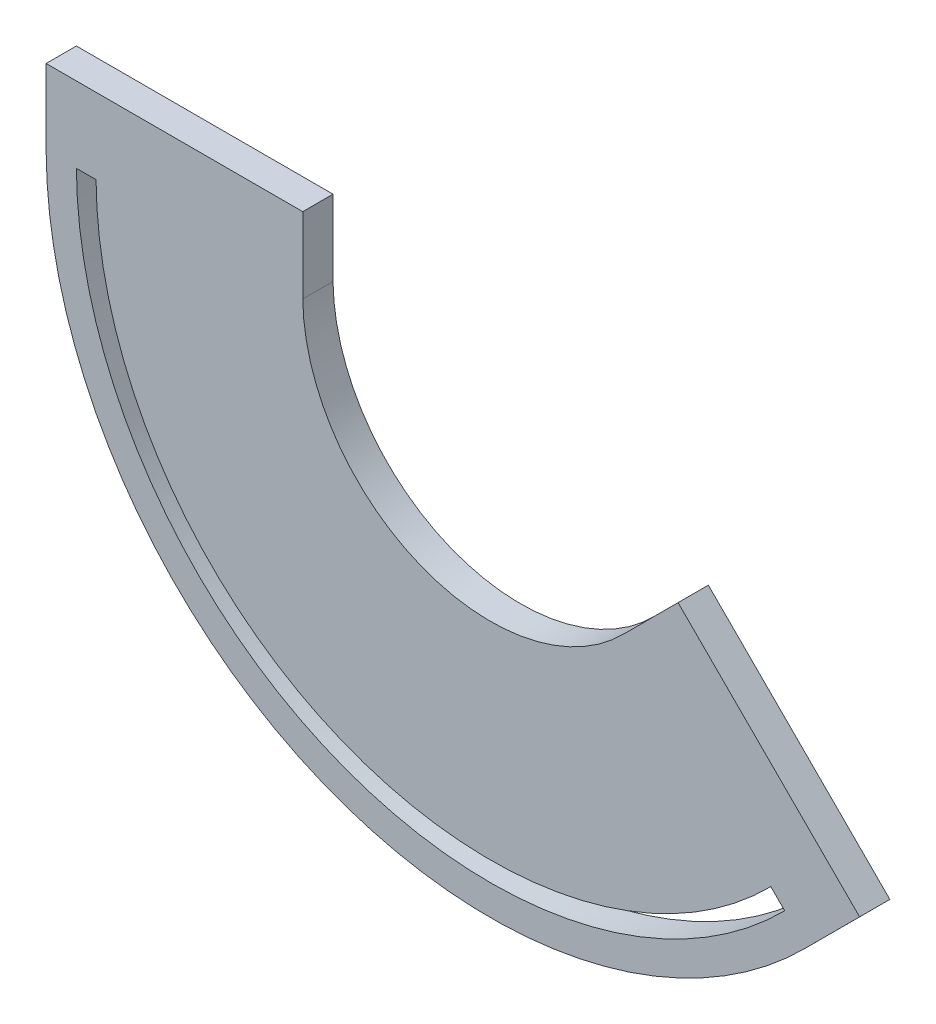
ISO-10303-21;
HEADER;
FILE_DESCRIPTION(('STEP AP214'),'2;1');
FILE_NAME('part.step','',(''),(''),'','','');
FILE_SCHEMA(('AUTOMOTIVE_DESIGN { 1 0 10303 214 1 1 1 1 }'));
ENDSEC;
DATA;
#1=APPLICATION_CONTEXT('core data for automotive mechanical design processes');
#2=APPLICATION_PROTOCOL_DEFINITION('international standard','automotive_design',2000,#1);
#3=PRODUCT_CONTEXT('',#1,'mechanical');
#4=PRODUCT('Part','Part','',(#3));
#5=PRODUCT_RELATED_PRODUCT_CATEGORY('part','',(#4));
#6=PRODUCT_DEFINITION_FORMATION('','',#4);
#7=PRODUCT_DEFINITION_CONTEXT('part definition',#1,'design');
#8=PRODUCT_DEFINITION('design','',#6,#7);
#9=PRODUCT_DEFINITION_SHAPE('','',#8);
#10=(LENGTH_UNIT() NAMED_UNIT(*) SI_UNIT(.MILLI.,.METRE.));
#11=(NAMED_UNIT(*) PLANE_ANGLE_UNIT() SI_UNIT($,.RADIAN.));
#12=(NAMED_UNIT(*) SI_UNIT($,.STERADIAN.) SOLID_ANGLE_UNIT());
#13=UNCERTAINTY_MEASURE_WITH_UNIT(LENGTH_MEASURE(1.E-05),#10,'distance_accuracy_value','');
#14=(GEOMETRIC_REPRESENTATION_CONTEXT(3) GLOBAL_UNCERTAINTY_ASSIGNED_CONTEXT((#13)) GLOBAL_UNIT_ASSIGNED_CONTEXT((#10,
#11,#12)) REPRESENTATION_CONTEXT('',''));
#15=CARTESIAN_POINT('',(0.,0.,0.));
#16=DIRECTION('',(0.,0.,1.));
#17=DIRECTION('',(1.,0.,0.));
#18=AXIS2_PLACEMENT_3D('',#15,#16,#17);
#19=CARTESIAN_POINT('',(0.,0.,5.08));
#20=DIRECTION('',(0.,0.,-1.));
#21=DIRECTION('',(-1.,0.,0.));
#22=AXIS2_PLACEMENT_3D('',#19,#20,#21);
#23=CYLINDRICAL_SURFACE('',#22,31.496);
#24=CARTESIAN_POINT('',(0.,0.,0.));
#25=DIRECTION('',(0.,0.,-1.));
#26=DIRECTION('',(1.,0.,0.));
#27=AXIS2_PLACEMENT_3D('',#24,#25,#26);
#28=CIRCLE('',#27,31.496);
#29=CARTESIAN_POINT('',(22.5377251884212,-22.001112683935,0.));
#30=VERTEX_POINT('',#29);
#31=CARTESIAN_POINT('',(-31.4937142857113,-0.379442340791523,0.));
#32=VERTEX_POINT('',#31);
#33=EDGE_CURVE('E156',#30,#32,#28,.T.);
#34=ORIENTED_EDGE('',*,*,#33,.T.);
#35=DIRECTION('',(0.,0.,-1.));
#36=VECTOR('',#35,1.);
#37=CARTESIAN_POINT('',(-31.4937142857113,-0.379442340791523,5.08));
#38=LINE('',#37,#36);
#39=CARTESIAN_POINT('',(-31.4937142857113,-0.379442340791523,5.08));
#40=VERTEX_POINT('',#39);
#41=EDGE_CURVE('E11',#40,#32,#38,.T.);
#42=ORIENTED_EDGE('',*,*,#41,.F.);
#43=CARTESIAN_POINT('',(0.,0.,5.08));
#44=DIRECTION('',(0.,0.,-1.));
#45=DIRECTION('',(1.,0.,0.));
#46=AXIS2_PLACEMENT_3D('',#43,#44,#45);
#47=CIRCLE('',#46,31.496);
#48=CARTESIAN_POINT('',(22.5377251884212,-22.001112683935,5.08));
#49=VERTEX_POINT('',#48);
#50=EDGE_CURVE('E160',#49,#40,#47,.T.);
#51=ORIENTED_EDGE('',*,*,#50,.F.);
#52=DIRECTION('',(0.,0.,-1.));
#53=VECTOR('',#52,1.);
#54=CARTESIAN_POINT('',(22.5377251884212,-22.001112683935,5.08));
#55=LINE('',#54,#53);
#56=EDGE_CURVE('E178',#49,#30,#55,.T.);
#57=ORIENTED_EDGE('',*,*,#56,.T.);
#58=EDGE_LOOP('',(#34,#42,#51,#57));
#59=FACE_BOUND('',#58,.T.);
#60=ADVANCED_FACE('F35',(#59),#23,.F.);
#61=CARTESIAN_POINT('',(-31.4937142857113,-0.379442340791523,5.08));
#62=DIRECTION('',(-1.,0.,0.));
#63=DIRECTION('',(0.,0.,1.));
#64=AXIS2_PLACEMENT_3D('',#61,#62,#63);
#65=PLANE('',#64);
#66=DIRECTION('',(0.,1.,0.));
#67=VECTOR('',#66,1.);
#68=CARTESIAN_POINT('',(-31.4937142857113,-0.379442340791523,0.));
#69=LINE('',#68,#67);
#70=CARTESIAN_POINT('',(-31.4937142857113,12.3205576592085,0.));
#71=VERTEX_POINT('',#70);
#72=EDGE_CURVE('E181',#32,#71,#69,.T.);
#73=ORIENTED_EDGE('',*,*,#72,.T.);
#74=DIRECTION('',(0.,0.,-1.));
#75=VECTOR('',#74,1.);
#76=CARTESIAN_POINT('',(-31.4937142857113,12.3205576592085,5.08));
#77=LINE('',#76,#75);
#78=CARTESIAN_POINT('',(-31.4937142857113,12.3205576592085,5.08));
#79=VERTEX_POINT('',#78);
#80=EDGE_CURVE('E42',#79,#71,#77,.T.);
#81=ORIENTED_EDGE('',*,*,#80,.F.);
#82=DIRECTION('',(0.,1.,0.));
#83=VECTOR('',#82,1.);
#84=CARTESIAN_POINT('',(-31.4937142857113,-0.379442340791523,5.08));
#85=LINE('',#84,#83);
#86=EDGE_CURVE('E163',#40,#79,#85,.T.);
#87=ORIENTED_EDGE('',*,*,#86,.F.);
#88=ORIENTED_EDGE('',*,*,#41,.T.);
#89=EDGE_LOOP('',(#73,#81,#87,#88));
#90=FACE_BOUND('',#89,.T.);
#91=ADVANCED_FACE('F236',(#90),#65,.F.);
#92=CARTESIAN_POINT('',(-74.5750346393202,12.3205576592085,5.08));
#93=DIRECTION('',(0.,-1.,0.));
#94=DIRECTION('',(0.,0.,-1.));
#95=AXIS2_PLACEMENT_3D('',#92,#93,#94);
#96=PLANE('',#95);
#97=DIRECTION('',(-1.,0.,0.));
#98=VECTOR('',#97,1.);
#99=CARTESIAN_POINT('',(-74.5750346393202,12.3205576592085,0.));
#100=LINE('',#99,#98);
#101=CARTESIAN_POINT('',(-74.5750346393202,12.3205576592085,0.));
#102=VERTEX_POINT('',#101);
#103=EDGE_CURVE('E183',#71,#102,#100,.T.);
#104=ORIENTED_EDGE('',*,*,#103,.T.);
#105=DIRECTION('',(0.,0.,-1.));
#106=VECTOR('',#105,1.);
#107=CARTESIAN_POINT('',(-74.5750346393202,12.3205576592085,5.08));
#108=LINE('',#107,#106);
#109=CARTESIAN_POINT('',(-74.5750346393202,12.3205576592085,5.08));
#110=VERTEX_POINT('',#109);
#111=EDGE_CURVE('E208',#110,#102,#108,.T.);
#112=ORIENTED_EDGE('',*,*,#111,.F.);
#113=DIRECTION('',(-1.,0.,0.));
#114=VECTOR('',#113,1.);
#115=CARTESIAN_POINT('',(-74.5750346393202,12.3205576592085,5.08));
#116=LINE('',#115,#114);
#117=EDGE_CURVE('E166',#79,#110,#116,.T.);
#118=ORIENTED_EDGE('',*,*,#117,.F.);
#119=ORIENTED_EDGE('',*,*,#80,.T.);
#120=EDGE_LOOP('',(#104,#112,#118,#119));
#121=FACE_BOUND('',#120,.T.);
#122=ADVANCED_FACE('F215',(#121),#96,.F.);
#123=CARTESIAN_POINT('',(-74.5750346393202,-0.379442340791523,5.08));
#124=DIRECTION('',(1.,0.,0.));
#125=DIRECTION('',(0.,0.,-1.));
#126=AXIS2_PLACEMENT_3D('',#123,#124,#125);
#127=PLANE('',#126);
#128=DIRECTION('',(0.,-1.,0.));
#129=VECTOR('',#128,1.);
#130=CARTESIAN_POINT('',(-74.5750346393202,-0.379442340791523,0.));
#131=LINE('',#130,#129);
#132=CARTESIAN_POINT('',(-74.5750346393202,-0.379442340791523,0.));
#133=VERTEX_POINT('',#132);
#134=EDGE_CURVE('E185',#102,#133,#131,.T.);
#135=ORIENTED_EDGE('',*,*,#134,.T.);
#136=DIRECTION('',(0.,0.,-1.));
#137=VECTOR('',#136,1.);
#138=CARTESIAN_POINT('',(-74.5750346393202,-0.379442340791523,5.08));
#139=LINE('',#138,#137);
#140=CARTESIAN_POINT('',(-74.5750346393202,-0.379442340791523,5.08));
#141=VERTEX_POINT('',#140);
#142=EDGE_CURVE('E205',#141,#133,#139,.T.);
#143=ORIENTED_EDGE('',*,*,#142,.F.);
#144=DIRECTION('',(0.,-1.,0.));
#145=VECTOR('',#144,1.);
#146=CARTESIAN_POINT('',(-74.5750346393202,-0.379442340791523,5.08));
#147=LINE('',#146,#145);
#148=EDGE_CURVE('E168',#110,#141,#147,.T.);
#149=ORIENTED_EDGE('',*,*,#148,.F.);
#150=ORIENTED_EDGE('',*,*,#111,.T.);
#151=EDGE_LOOP('',(#135,#143,#149,#150));
#152=FACE_BOUND('',#151,.T.);
#153=ADVANCED_FACE('F224',(#152),#127,.F.);
#154=CARTESIAN_POINT('',(0.,0.,5.08));
#155=DIRECTION('',(0.,0.,-1.));
#156=DIRECTION('',(-1.,0.,0.));
#157=AXIS2_PLACEMENT_3D('',#154,#155,#156);
#158=CYLINDRICAL_SURFACE('',#157,74.575999946);
#159=CARTESIAN_POINT('',(0.,0.,0.));
#160=DIRECTION('',(0.,0.,1.));
#161=DIRECTION('',(1.,0.,0.));
#162=AXIS2_PLACEMENT_3D('',#159,#160,#161);
#163=CIRCLE('',#162,74.575999946);
#164=CARTESIAN_POINT('',(53.011677084345,-52.4532349874717,0.));
#165=VERTEX_POINT('',#164);
#166=EDGE_CURVE('E187',#133,#165,#163,.T.);
#167=ORIENTED_EDGE('',*,*,#166,.T.);
#168=DIRECTION('',(0.,0.,-1.));
#169=VECTOR('',#168,1.);
#170=CARTESIAN_POINT('',(53.011677084345,-52.4532349874717,5.08));
#171=LINE('',#170,#169);
#172=CARTESIAN_POINT('',(53.011677084345,-52.4532349874717,5.08));
#173=VERTEX_POINT('',#172);
#174=EDGE_CURVE('E202',#173,#165,#171,.T.);
#175=ORIENTED_EDGE('',*,*,#174,.F.);
#176=CARTESIAN_POINT('',(0.,0.,5.08));
#177=DIRECTION('',(0.,0.,1.));
#178=DIRECTION('',(1.,0.,0.));
#179=AXIS2_PLACEMENT_3D('',#176,#177,#178);
#180=CIRCLE('',#179,74.575999946);
#181=EDGE_CURVE('E170',#141,#173,#180,.T.);
#182=ORIENTED_EDGE('',*,*,#181,.F.);
#183=ORIENTED_EDGE('',*,*,#142,.T.);
#184=EDGE_LOOP('',(#167,#175,#182,#183));
#185=FACE_BOUND('',#184,.T.);
#186=ADVANCED_FACE('F228',(#185),#158,.T.);
#187=CARTESIAN_POINT('',(53.011677084345,-52.4532349874716,5.08));
#188=DIRECTION('',(-0.707360089588814,0.706853382008536,0.));
#189=DIRECTION('',(-0.706853382008536,-0.707360089588814,0.));
#190=AXIS2_PLACEMENT_3D('',#187,#188,#189);
#191=PLANE('',#190);
#192=DIRECTION('',(0.706853382008536,0.707360089588814,0.));
#193=VECTOR('',#192,1.);
#194=CARTESIAN_POINT('',(53.011677084345,-52.4532349874716,0.));
#195=LINE('',#194,#193);
#196=CARTESIAN_POINT('',(61.9887150358534,-43.4697618496937,0.));
#197=VERTEX_POINT('',#196);
#198=EDGE_CURVE('E189',#165,#197,#195,.T.);
#199=ORIENTED_EDGE('',*,*,#198,.T.);
#200=DIRECTION('',(0.,0.,-1.));
#201=VECTOR('',#200,1.);
#202=CARTESIAN_POINT('',(61.9887150358534,-43.4697618496937,5.08));
#203=LINE('',#202,#201);
#204=CARTESIAN_POINT('',(61.9887150358534,-43.4697618496937,5.08));
#205=VERTEX_POINT('',#204);
#206=EDGE_CURVE('E199',#205,#197,#203,.T.);
#207=ORIENTED_EDGE('',*,*,#206,.F.);
#208=DIRECTION('',(0.706853382008536,0.707360089588814,0.));
#209=VECTOR('',#208,1.);
#210=CARTESIAN_POINT('',(53.011677084345,-52.4532349874716,5.08));
#211=LINE('',#210,#209);
#212=EDGE_CURVE('E172',#173,#205,#211,.T.);
#213=ORIENTED_EDGE('',*,*,#212,.F.);
#214=ORIENTED_EDGE('',*,*,#174,.T.);
#215=EDGE_LOOP('',(#199,#207,#213,#214));
#216=FACE_BOUND('',#215,.T.);
#217=ADVANCED_FACE('F249',(#216),#191,.F.);
#218=CARTESIAN_POINT('',(31.5147631399296,-13.017639546157,5.08));
#219=DIRECTION('',(-0.706853382008536,-0.707360089588814,0.));
#220=DIRECTION('',(0.707360089588814,-0.706853382008536,0.));
#221=AXIS2_PLACEMENT_3D('',#218,#219,#220);
#222=PLANE('',#221);
#223=DIRECTION('',(-0.707360089588814,0.706853382008536,0.));
#224=VECTOR('',#223,1.);
#225=CARTESIAN_POINT('',(31.5147631399296,-13.017639546157,0.));
#226=LINE('',#225,#224);
#227=CARTESIAN_POINT('',(31.5147631399296,-13.017639546157,0.));
#228=VERTEX_POINT('',#227);
#229=EDGE_CURVE('E191',#197,#228,#226,.T.);
#230=ORIENTED_EDGE('',*,*,#229,.T.);
#231=DIRECTION('',(0.,0.,-1.));
#232=VECTOR('',#231,1.);
#233=CARTESIAN_POINT('',(31.5147631399296,-13.017639546157,5.08));
#234=LINE('',#233,#232);
#235=CARTESIAN_POINT('',(31.5147631399296,-13.017639546157,5.08));
#236=VERTEX_POINT('',#235);
#237=EDGE_CURVE('E196',#236,#228,#234,.T.);
#238=ORIENTED_EDGE('',*,*,#237,.F.);
#239=DIRECTION('',(-0.707360089588814,0.706853382008536,0.));
#240=VECTOR('',#239,1.);
#241=CARTESIAN_POINT('',(31.5147631399296,-13.017639546157,5.08));
#242=LINE('',#241,#240);
#243=EDGE_CURVE('E174',#205,#236,#242,.T.);
#244=ORIENTED_EDGE('',*,*,#243,.F.);
#245=ORIENTED_EDGE('',*,*,#206,.T.);
#246=EDGE_LOOP('',(#230,#238,#244,#245));
#247=FACE_BOUND('',#246,.T.);
#248=ADVANCED_FACE('F247',(#247),#222,.F.);
#249=CARTESIAN_POINT('',(22.5377251884212,-22.001112683935,5.08));
#250=DIRECTION('',(0.707360089588814,-0.706853382008536,0.));
#251=DIRECTION('',(0.706853382008536,0.707360089588814,0.));
#252=AXIS2_PLACEMENT_3D('',#249,#250,#251);
#253=PLANE('',#252);
#254=DIRECTION('',(-0.706853382008536,-0.707360089588814,0.));
#255=VECTOR('',#254,1.);
#256=CARTESIAN_POINT('',(22.5377251884212,-22.001112683935,0.));
#257=LINE('',#256,#255);
#258=EDGE_CURVE('E164',#228,#30,#257,.T.);
#259=ORIENTED_EDGE('',*,*,#258,.T.);
#260=ORIENTED_EDGE('',*,*,#56,.F.);
#261=DIRECTION('',(-0.706853382008536,-0.707360089588814,0.));
#262=VECTOR('',#261,1.);
#263=CARTESIAN_POINT('',(22.5377251884212,-22.001112683935,5.08));
#264=LINE('',#263,#262);
#265=EDGE_CURVE('E176',#236,#49,#264,.T.);
#266=ORIENTED_EDGE('',*,*,#265,.F.);
#267=ORIENTED_EDGE('',*,*,#237,.T.);
#268=EDGE_LOOP('',(#259,#260,#266,#267));
#269=FACE_BOUND('',#268,.T.);
#270=ADVANCED_FACE('F242',(#269),#253,.F.);
#271=CARTESIAN_POINT('',(0.,0.,5.08));
#272=DIRECTION('',(0.,0.,1.));
#273=DIRECTION('',(1.,0.,0.));
#274=AXIS2_PLACEMENT_3D('',#271,#272,#273);
#275=PLANE('',#274);
#276=CARTESIAN_POINT('',(0.,0.,5.08));
#277=DIRECTION('',(0.,0.,1.));
#278=DIRECTION('',(1.,0.,0.));
#279=AXIS2_PLACEMENT_3D('',#276,#277,#278);
#280=CIRCLE('',#279,69.4960705076934);
#281=CARTESIAN_POINT('',(-69.4950346393202,-0.379442340791523,5.08));
#282=VERTEX_POINT('',#281);
#283=CARTESIAN_POINT('',(49.4182907538128,-48.8624227293522,5.08));
#284=VERTEX_POINT('',#283);
#285=EDGE_CURVE('E49',#282,#284,#280,.T.);
#286=ORIENTED_EDGE('',*,*,#285,.F.);
#287=DIRECTION('',(-1.,0.,0.));
#288=VECTOR('',#287,1.);
#289=CARTESIAN_POINT('',(-69.4950346393202,-0.379442340791523,5.08));
#290=LINE('',#289,#288);
#291=CARTESIAN_POINT('',(-66.1930346393202,-0.379442340791523,5.08));
#292=VERTEX_POINT('',#291);
#293=EDGE_CURVE('E141',#292,#282,#290,.T.);
#294=ORIENTED_EDGE('',*,*,#293,.F.);
#295=CARTESIAN_POINT('',(0.,0.,5.08));
#296=DIRECTION('',(0.,0.,-1.));
#297=DIRECTION('',(1.,0.,0.));
#298=AXIS2_PLACEMENT_3D('',#295,#296,#297);
#299=CIRCLE('',#298,66.1941221805398);
#300=CARTESIAN_POINT('',(47.0825898796864,-46.5283950021218,5.08));
#301=VERTEX_POINT('',#300);
#302=EDGE_CURVE('E144',#301,#292,#299,.T.);
#303=ORIENTED_EDGE('',*,*,#302,.F.);
#304=DIRECTION('',(-0.707360089588813,0.706853382008537,0.));
#305=VECTOR('',#304,1.);
#306=CARTESIAN_POINT('',(47.0825898796865,-46.5283950021218,5.08));
#307=LINE('',#306,#305);
#308=EDGE_CURVE('E150',#284,#301,#307,.T.);
#309=ORIENTED_EDGE('',*,*,#308,.F.);
#310=EDGE_LOOP('',(#286,#294,#303,#309));
#311=FACE_BOUND('',#310,.T.);
#312=ORIENTED_EDGE('',*,*,#50,.T.);
#313=ORIENTED_EDGE('',*,*,#86,.T.);
#314=ORIENTED_EDGE('',*,*,#117,.T.);
#315=ORIENTED_EDGE('',*,*,#148,.T.);
#316=ORIENTED_EDGE('',*,*,#181,.T.);
#317=ORIENTED_EDGE('',*,*,#212,.T.);
#318=ORIENTED_EDGE('',*,*,#243,.T.);
#319=ORIENTED_EDGE('',*,*,#265,.T.);
#320=EDGE_LOOP('',(#312,#313,#314,#315,#316,#317,#318,#319));
#321=FACE_BOUND('',#320,.T.);
#322=ADVANCED_FACE('F232',(#311,#321),#275,.T.);
#323=CARTESIAN_POINT('',(0.,0.,0.));
#324=DIRECTION('',(0.,0.,1.));
#325=DIRECTION('',(1.,0.,0.));
#326=AXIS2_PLACEMENT_3D('',#323,#324,#325);
#327=PLANE('',#326);
#328=DIRECTION('',(-1.,0.,0.));
#329=VECTOR('',#328,1.);
#330=CARTESIAN_POINT('',(-69.4950346393202,-0.379442340791523,0.));
#331=LINE('',#330,#329);
#332=CARTESIAN_POINT('',(-66.1930346393202,-0.379442340791523,0.));
#333=VERTEX_POINT('',#332);
#334=CARTESIAN_POINT('',(-69.4950346393202,-0.379442340791523,0.));
#335=VERTEX_POINT('',#334);
#336=EDGE_CURVE('E131',#333,#335,#331,.T.);
#337=ORIENTED_EDGE('',*,*,#336,.T.);
#338=CARTESIAN_POINT('',(0.,0.,0.));
#339=DIRECTION('',(0.,0.,1.));
#340=DIRECTION('',(1.,0.,0.));
#341=AXIS2_PLACEMENT_3D('',#338,#339,#340);
#342=CIRCLE('',#341,69.4960705076934);
#343=CARTESIAN_POINT('',(49.4182907538128,-48.8624227293522,0.));
#344=VERTEX_POINT('',#343);
#345=EDGE_CURVE('E125',#335,#344,#342,.T.);
#346=ORIENTED_EDGE('',*,*,#345,.T.);
#347=DIRECTION('',(-0.707360089588813,0.706853382008537,0.));
#348=VECTOR('',#347,1.);
#349=CARTESIAN_POINT('',(47.0825898796865,-46.5283950021218,0.));
#350=LINE('',#349,#348);
#351=CARTESIAN_POINT('',(47.0825898796864,-46.5283950021218,0.));
#352=VERTEX_POINT('',#351);
#353=EDGE_CURVE('E134',#344,#352,#350,.T.);
#354=ORIENTED_EDGE('',*,*,#353,.T.);
#355=CARTESIAN_POINT('',(0.,0.,0.));
#356=DIRECTION('',(0.,0.,-1.));
#357=DIRECTION('',(1.,0.,0.));
#358=AXIS2_PLACEMENT_3D('',#355,#356,#357);
#359=CIRCLE('',#358,66.1941221805398);
#360=EDGE_CURVE('E57',#352,#333,#359,.T.);
#361=ORIENTED_EDGE('',*,*,#360,.T.);
#362=EDGE_LOOP('',(#337,#346,#354,#361));
#363=FACE_BOUND('',#362,.T.);
#364=ORIENTED_EDGE('',*,*,#33,.F.);
#365=ORIENTED_EDGE('',*,*,#258,.F.);
#366=ORIENTED_EDGE('',*,*,#229,.F.);
#367=ORIENTED_EDGE('',*,*,#198,.F.);
#368=ORIENTED_EDGE('',*,*,#166,.F.);
#369=ORIENTED_EDGE('',*,*,#134,.F.);
#370=ORIENTED_EDGE('',*,*,#103,.F.);
#371=ORIENTED_EDGE('',*,*,#72,.F.);
#372=EDGE_LOOP('',(#364,#365,#366,#367,#368,#369,#370,#371));
#373=FACE_BOUND('',#372,.T.);
#374=ADVANCED_FACE('F138',(#363,#373),#327,.F.);
#375=CARTESIAN_POINT('',(0.,0.,0.));
#376=DIRECTION('',(0.,0.,1.));
#377=DIRECTION('',(1.,0.,0.));
#378=AXIS2_PLACEMENT_3D('',#375,#376,#377);
#379=CYLINDRICAL_SURFACE('',#378,69.4960705076934);
#380=ORIENTED_EDGE('',*,*,#285,.T.);
#381=DIRECTION('',(0.,0.,1.));
#382=VECTOR('',#381,1.);
#383=CARTESIAN_POINT('',(49.4182907538128,-48.8624227293522,0.));
#384=LINE('',#383,#382);
#385=EDGE_CURVE('E121',#344,#284,#384,.T.);
#386=ORIENTED_EDGE('',*,*,#385,.F.);
#387=ORIENTED_EDGE('',*,*,#345,.F.);
#388=DIRECTION('',(0.,0.,1.));
#389=VECTOR('',#388,1.);
#390=CARTESIAN_POINT('',(-69.4950346393202,-0.379442340791523,0.));
#391=LINE('',#390,#389);
#392=EDGE_CURVE('E154',#335,#282,#391,.T.);
#393=ORIENTED_EDGE('',*,*,#392,.T.);
#394=EDGE_LOOP('',(#380,#386,#387,#393));
#395=FACE_BOUND('',#394,.T.);
#396=ADVANCED_FACE('F123',(#395),#379,.F.);
#397=CARTESIAN_POINT('',(-69.4950346393202,-0.379442340791523,0.));
#398=DIRECTION('',(0.,1.,0.));
#399=DIRECTION('',(0.,0.,1.));
#400=AXIS2_PLACEMENT_3D('',#397,#398,#399);
#401=PLANE('',#400);
#402=ORIENTED_EDGE('',*,*,#293,.T.);
#403=ORIENTED_EDGE('',*,*,#392,.F.);
#404=ORIENTED_EDGE('',*,*,#336,.F.);
#405=DIRECTION('',(0.,0.,1.));
#406=VECTOR('',#405,1.);
#407=CARTESIAN_POINT('',(-66.1930346393202,-0.379442340791523,0.));
#408=LINE('',#407,#406);
#409=EDGE_CURVE('E157',#333,#292,#408,.T.);
#410=ORIENTED_EDGE('',*,*,#409,.T.);
#411=EDGE_LOOP('',(#402,#403,#404,#410));
#412=FACE_BOUND('',#411,.T.);
#413=ADVANCED_FACE('F320',(#412),#401,.F.);
#414=CARTESIAN_POINT('',(0.,0.,0.));
#415=DIRECTION('',(0.,0.,1.));
#416=DIRECTION('',(1.,0.,0.));
#417=AXIS2_PLACEMENT_3D('',#414,#415,#416);
#418=CYLINDRICAL_SURFACE('',#417,66.1941221805398);
#419=ORIENTED_EDGE('',*,*,#302,.T.);
#420=ORIENTED_EDGE('',*,*,#409,.F.);
#421=ORIENTED_EDGE('',*,*,#360,.F.);
#422=DIRECTION('',(0.,0.,1.));
#423=VECTOR('',#422,1.);
#424=CARTESIAN_POINT('',(47.0825898796864,-46.5283950021218,0.));
#425=LINE('',#424,#423);
#426=EDGE_CURVE('E130',#352,#301,#425,.T.);
#427=ORIENTED_EDGE('',*,*,#426,.T.);
#428=EDGE_LOOP('',(#419,#420,#421,#427));
#429=FACE_BOUND('',#428,.T.);
#430=ADVANCED_FACE('F329',(#429),#418,.T.);
#431=CARTESIAN_POINT('',(47.0825898796865,-46.5283950021218,0.));
#432=DIRECTION('',(0.706853382008537,0.707360089588813,0.));
#433=DIRECTION('',(-0.707360089588813,0.706853382008537,0.));
#434=AXIS2_PLACEMENT_3D('',#431,#432,#433);
#435=PLANE('',#434);
#436=ORIENTED_EDGE('',*,*,#308,.T.);
#437=ORIENTED_EDGE('',*,*,#426,.F.);
#438=ORIENTED_EDGE('',*,*,#353,.F.);
#439=ORIENTED_EDGE('',*,*,#385,.T.);
#440=EDGE_LOOP('',(#436,#437,#438,#439));
#441=FACE_BOUND('',#440,.T.);
#442=ADVANCED_FACE('F135',(#441),#435,.F.);
#443=CLOSED_SHELL('',(#60,#91,#122,#153,#186,#217,#248,#270,#322,#374,#396,#413,#430,#442));
#444=MANIFOLD_SOLID_BREP('B2',#443);
#445=ADVANCED_BREP_SHAPE_REPRESENTATION('',(#18,#444),#14);
#446=SHAPE_DEFINITION_REPRESENTATION(#9,#445);
ENDSEC;
END-ISO-10303-21;
